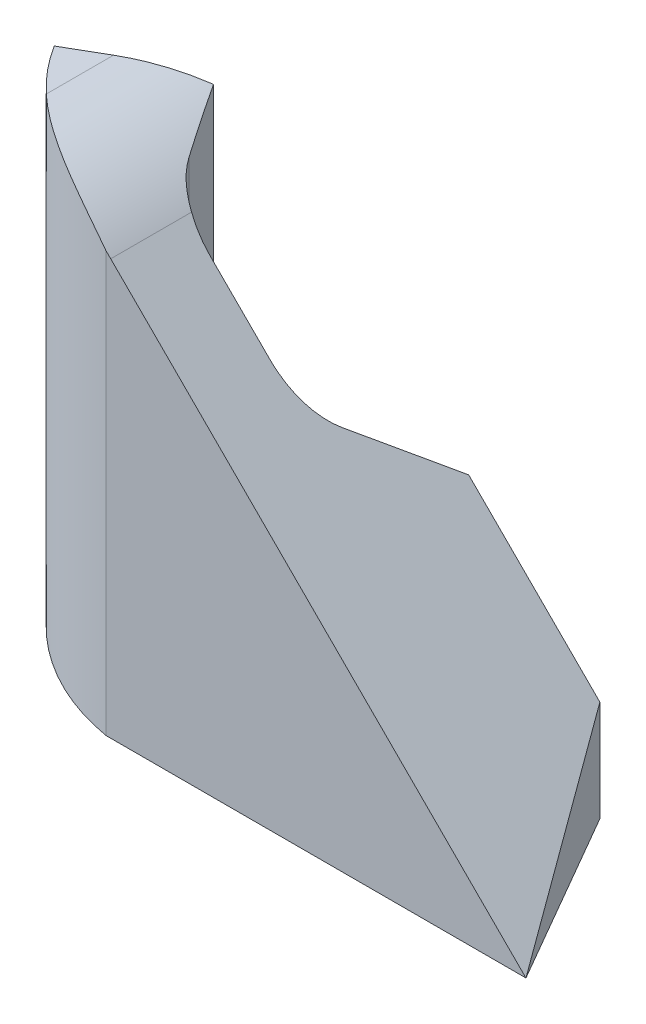
ISO-10303-21;
HEADER;
FILE_DESCRIPTION(('STEP AP214'),'2;1');
FILE_NAME('part.step','',(''),(''),'','','');
FILE_SCHEMA(('AUTOMOTIVE_DESIGN { 1 0 10303 214 1 1 1 1 }'));
ENDSEC;
DATA;
#1=APPLICATION_CONTEXT('core data for automotive mechanical design processes');
#2=APPLICATION_PROTOCOL_DEFINITION('international standard','automotive_design',2000,#1);
#3=PRODUCT_CONTEXT('',#1,'mechanical');
#4=PRODUCT('Part','Part','',(#3));
#5=PRODUCT_RELATED_PRODUCT_CATEGORY('part','',(#4));
#6=PRODUCT_DEFINITION_FORMATION('','',#4);
#7=PRODUCT_DEFINITION_CONTEXT('part definition',#1,'design');
#8=PRODUCT_DEFINITION('design','',#6,#7);
#9=PRODUCT_DEFINITION_SHAPE('','',#8);
#10=(LENGTH_UNIT() NAMED_UNIT(*) SI_UNIT(.MILLI.,.METRE.));
#11=(NAMED_UNIT(*) PLANE_ANGLE_UNIT() SI_UNIT($,.RADIAN.));
#12=(NAMED_UNIT(*) SI_UNIT($,.STERADIAN.) SOLID_ANGLE_UNIT());
#13=UNCERTAINTY_MEASURE_WITH_UNIT(LENGTH_MEASURE(1.E-05),#10,'distance_accuracy_value','');
#14=(GEOMETRIC_REPRESENTATION_CONTEXT(3) GLOBAL_UNCERTAINTY_ASSIGNED_CONTEXT((#13)) GLOBAL_UNIT_ASSIGNED_CONTEXT((#10,
#11,#12)) REPRESENTATION_CONTEXT('',''));
#15=CARTESIAN_POINT('',(0.,0.,0.));
#16=DIRECTION('',(0.,0.,1.));
#17=DIRECTION('',(1.,0.,0.));
#18=AXIS2_PLACEMENT_3D('',#15,#16,#17);
#19=CARTESIAN_POINT('',(84.7532992108684,80.,-39.1871510775911));
#20=DIRECTION('',(0.,-1.,0.));
#21=DIRECTION('',(0.,0.,-1.));
#22=AXIS2_PLACEMENT_3D('',#19,#20,#21);
#23=CYLINDRICAL_SURFACE('',#22,39.7648067995995);
#24=DIRECTION('',(0.,-1.,0.));
#25=VECTOR('',#24,1.);
#26=CARTESIAN_POINT('',(77.9999999999994,80.,0.));
#27=LINE('',#26,#25);
#28=CARTESIAN_POINT('',(77.9999999999994,71.9718433985966,0.));
#29=VERTEX_POINT('',#28);
#30=CARTESIAN_POINT('',(77.9999999999994,0.,0.));
#31=VERTEX_POINT('',#30);
#32=EDGE_CURVE('E146',#29,#31,#27,.T.);
#33=ORIENTED_EDGE('',*,*,#32,.F.);
#34=CARTESIAN_POINT('',(77.9999999999994,71.9718433985966,0.));
#35=CARTESIAN_POINT('',(77.7335986619102,72.2195183677995,-0.0459073022775095));
#36=CARTESIAN_POINT('',(77.4630042014682,72.4620357358725,-0.0953401702948594));
#37=CARTESIAN_POINT('',(76.9140353574111,72.9364070782736,-0.201718899229497));
#38=CARTESIAN_POINT('',(76.6356606105425,73.1682605533742,-0.258665111400422));
#39=CARTESIAN_POINT('',(76.0717107837595,73.6209742395291,-0.380539368932625));
#40=CARTESIAN_POINT('',(75.786134391271,73.8418324244412,-0.445468877812701));
#41=CARTESIAN_POINT('',(75.2085472406642,74.2721684005322,-0.583708182089227));
#42=CARTESIAN_POINT('',(74.9165365938317,74.4816463883244,-0.657017832635819));
#43=CARTESIAN_POINT('',(74.0352357765432,75.0902705688337,-0.889235820381399));
#44=CARTESIAN_POINT('',(73.4373461667372,75.472273521661,-1.06114041682028));
#45=CARTESIAN_POINT('',(72.2251335851486,76.1883194185665,-1.44210372319843));
#46=CARTESIAN_POINT('',(71.610812865398,76.5223688955463,-1.65115736346832));
#47=CARTESIAN_POINT('',(70.370520504923,77.1425968785391,-2.10867417547363));
#48=CARTESIAN_POINT('',(69.7445228537363,77.4286494184168,-2.35723781423036));
#49=CARTESIAN_POINT('',(68.4891576924157,77.951976990873,-2.89412644327581));
#50=CARTESIAN_POINT('',(67.8597899040653,78.1892479306199,-3.18245476647861));
#51=CARTESIAN_POINT('',(66.603441804,78.616477038177,-3.79911743907938));
#52=CARTESIAN_POINT('',(65.9764661427202,78.8063676450469,-4.12750793265412));
#53=CARTESIAN_POINT('',(64.7320271951322,79.1405539467785,-4.82297639926268));
#54=CARTESIAN_POINT('',(64.1145628244505,79.2848548764285,-5.19004992409725));
#55=CARTESIAN_POINT('',(62.9804223044365,79.5135950197848,-5.9070293495262));
#56=CARTESIAN_POINT('',(62.4617831542531,79.6035986122286,-6.25209072772108));
#57=CARTESIAN_POINT('',(61.4385189087551,79.7544923587507,-6.96835373908412));
#58=CARTESIAN_POINT('',(60.933894219566,79.8153816699529,-7.33955612869351));
#59=CARTESIAN_POINT('',(59.9422380733915,79.9104852415791,-8.10591952332908));
#60=CARTESIAN_POINT('',(59.455172672871,79.9447539267262,-8.50102985634323));
#61=CARTESIAN_POINT('',(58.7386850550771,79.9783211654342,-9.11094559393041));
#62=CARTESIAN_POINT('',(58.5022301611165,79.9865376821463,-9.31710475288899));
#63=CARTESIAN_POINT('',(58.0342049693713,79.9973767247314,-9.73501571502693));
#64=CARTESIAN_POINT('',(57.8026344201574,79.9999995392483,-9.94676722906085));
#65=CARTESIAN_POINT('',(57.5735931288057,80.,-10.161241322647));
#66=B_SPLINE_CURVE_WITH_KNOTS('',3,(#34,#35,#36,#37,#38,#39,#40,#41,#42,#43,#44,#45,#46,#47,#48,
#49,#50,#51,#52,#53,#54,#55,#56,#57,#58,#59,#60,#61,#62,#63,#64,#65),.UNSPECIFIED.,.F.,.F.,(4,2,
2,2,2,2,2,2,2,2,2,2,2,2,2,4),(0.,1.09982775196754,2.1997069398163,3.29978806186719,
4.39985017200724,6.58704212809706,8.77393583057388,10.9664821013058,13.1592122541579,
15.3550514398785,17.5506383988797,19.4374786655233,21.3243735540279,23.207400539619,
24.1487288660829,25.0900086173079),.UNSPECIFIED.);
#67=CARTESIAN_POINT('',(57.5735931288057,80.,-10.161241322647));
#68=VERTEX_POINT('',#67);
#69=EDGE_CURVE('E188',#29,#68,#66,.T.);
#70=ORIENTED_EDGE('',*,*,#69,.T.);
#71=CARTESIAN_POINT('',(84.7532992108684,80.,-39.1871510775911));
#72=DIRECTION('',(0.,1.,0.));
#73=DIRECTION('',(0.,0.,1.));
#74=AXIS2_PLACEMENT_3D('',#71,#72,#73);
#75=CIRCLE('',#74,39.7648067995995);
#76=CARTESIAN_POINT('',(51.120447451922,80.,-17.9722708665173));
#77=VERTEX_POINT('',#76);
#78=EDGE_CURVE('E169',#77,#68,#75,.T.);
#79=ORIENTED_EDGE('',*,*,#78,.F.);
#80=DIRECTION('',(0.,-1.,0.));
#81=VECTOR('',#80,1.);
#82=CARTESIAN_POINT('',(51.120447451922,80.,-17.9722708665173));
#83=LINE('',#82,#81);
#84=CARTESIAN_POINT('',(51.120447451922,0.,-17.9722708665173));
#85=VERTEX_POINT('',#84);
#86=EDGE_CURVE('E170',#77,#85,#83,.T.);
#87=ORIENTED_EDGE('',*,*,#86,.T.);
#88=CARTESIAN_POINT('',(84.7532992108684,0.,-39.1871510775911));
#89=DIRECTION('',(0.,1.,0.));
#90=DIRECTION('',(0.,0.,1.));
#91=AXIS2_PLACEMENT_3D('',#88,#89,#90);
#92=CIRCLE('',#91,39.7648067995995);
#93=EDGE_CURVE('E139',#85,#31,#92,.T.);
#94=ORIENTED_EDGE('',*,*,#93,.T.);
#95=EDGE_LOOP('',(#33,#70,#79,#87,#94));
#96=FACE_BOUND('',#95,.T.);
#97=ADVANCED_FACE('F33',(#96),#23,.T.);
#98=CARTESIAN_POINT('',(77.9999999999994,80.,0.));
#99=DIRECTION('',(0.,0.,-1.));
#100=DIRECTION('',(-1.,0.,0.));
#101=AXIS2_PLACEMENT_3D('',#98,#99,#100);
#102=PLANE('',#101);
#103=DIRECTION('',(0.707106781186551,-0.707106781186543,0.));
#104=VECTOR('',#103,1.);
#105=CARTESIAN_POINT('',(69.9999999999985,80.,0.));
#106=LINE('',#105,#104);
#107=CARTESIAN_POINT('',(78.786796564402,71.2132034355966,0.));
#108=VERTEX_POINT('',#107);
#109=CARTESIAN_POINT('',(149.999999999999,0.,0.));
#110=VERTEX_POINT('',#109);
#111=EDGE_CURVE('E118',#108,#110,#106,.T.);
#112=ORIENTED_EDGE('',*,*,#111,.F.);
#113=CARTESIAN_POINT('',(57.5735931288057,50.,0.));
#114=DIRECTION('',(0.,0.,-1.));
#115=DIRECTION('',(-1.,0.,0.));
#116=AXIS2_PLACEMENT_3D('',#113,#114,#115);
#117=CIRCLE('',#116,30.);
#118=EDGE_CURVE('E186',#108,#29,#117,.F.);
#119=ORIENTED_EDGE('',*,*,#118,.T.);
#120=ORIENTED_EDGE('',*,*,#32,.T.);
#121=DIRECTION('',(1.,0.,0.));
#122=VECTOR('',#121,1.);
#123=CARTESIAN_POINT('',(77.9999999999994,0.,0.));
#124=LINE('',#123,#122);
#125=EDGE_CURVE('E143',#31,#110,#124,.T.);
#126=ORIENTED_EDGE('',*,*,#125,.T.);
#127=EDGE_LOOP('',(#112,#119,#120,#126));
#128=FACE_BOUND('',#127,.T.);
#129=ADVANCED_FACE('F144',(#128),#102,.F.);
#130=CARTESIAN_POINT('',(132.679491924311,80.,-30.));
#131=DIRECTION('',(-0.866025403784444,0.,0.499999999999992));
#132=DIRECTION('',(0.499999999999992,0.,0.866025403784444));
#133=AXIS2_PLACEMENT_3D('',#130,#131,#132);
#134=PLANE('',#133);
#135=DIRECTION('',(0.,-1.,0.));
#136=VECTOR('',#135,1.);
#137=CARTESIAN_POINT('',(132.679491924311,80.,-30.));
#138=LINE('',#137,#136);
#139=CARTESIAN_POINT('',(132.679491924311,17.3205080756882,-30.));
#140=VERTEX_POINT('',#139);
#141=CARTESIAN_POINT('',(132.679491924311,0.,-30.));
#142=VERTEX_POINT('',#141);
#143=EDGE_CURVE('E138',#140,#142,#138,.T.);
#144=ORIENTED_EDGE('',*,*,#143,.F.);
#145=DIRECTION('',(0.447213595499953,-0.447213595499948,0.774596669241492));
#146=VECTOR('',#145,1.);
#147=CARTESIAN_POINT('',(120.143593539449,29.85640646055,-51.712812921102));
#148=LINE('',#147,#146);
#149=EDGE_CURVE('E123',#140,#110,#148,.T.);
#150=ORIENTED_EDGE('',*,*,#149,.T.);
#151=DIRECTION('',(-0.499999999999992,0.,-0.866025403784444));
#152=VECTOR('',#151,1.);
#153=CARTESIAN_POINT('',(132.679491924311,0.,-30.));
#154=LINE('',#153,#152);
#155=EDGE_CURVE('E136',#110,#142,#154,.T.);
#156=ORIENTED_EDGE('',*,*,#155,.T.);
#157=EDGE_LOOP('',(#144,#150,#156));
#158=FACE_BOUND('',#157,.T.);
#159=ADVANCED_FACE('F134',(#158),#134,.F.);
#160=CARTESIAN_POINT('',(110.179491924311,80.,-30.));
#161=DIRECTION('',(0.,0.,1.));
#162=DIRECTION('',(1.,0.,0.));
#163=AXIS2_PLACEMENT_3D('',#160,#161,#162);
#164=PLANE('',#163);
#165=DIRECTION('',(0.,-1.,0.));
#166=VECTOR('',#165,1.);
#167=CARTESIAN_POINT('',(110.179491924311,80.,-30.));
#168=LINE('',#167,#166);
#169=CARTESIAN_POINT('',(110.179491924311,39.8205080756879,-30.));
#170=VERTEX_POINT('',#169);
#171=CARTESIAN_POINT('',(110.179491924311,0.,-30.));
#172=VERTEX_POINT('',#171);
#173=EDGE_CURVE('E181',#170,#172,#168,.T.);
#174=ORIENTED_EDGE('',*,*,#173,.F.);
#175=DIRECTION('',(0.707106781186552,-0.707106781186544,0.));
#176=VECTOR('',#175,1.);
#177=CARTESIAN_POINT('',(90.089745962155,59.9102540378437,-30.));
#178=LINE('',#177,#176);
#179=EDGE_CURVE('E140',#170,#140,#178,.T.);
#180=ORIENTED_EDGE('',*,*,#179,.T.);
#181=ORIENTED_EDGE('',*,*,#143,.T.);
#182=DIRECTION('',(-1.,0.,0.));
#183=VECTOR('',#182,1.);
#184=CARTESIAN_POINT('',(110.179491924311,0.,-30.));
#185=LINE('',#184,#183);
#186=EDGE_CURVE('E152',#142,#172,#185,.T.);
#187=ORIENTED_EDGE('',*,*,#186,.T.);
#188=EDGE_LOOP('',(#174,#180,#181,#187));
#189=FACE_BOUND('',#188,.T.);
#190=ADVANCED_FACE('F207',(#189),#164,.F.);
#191=CARTESIAN_POINT('',(110.179491924311,80.,-30.));
#192=DIRECTION('',(0.819152044288989,0.,0.57357643635105));
#193=DIRECTION('',(0.57357643635105,0.,-0.819152044288989));
#194=AXIS2_PLACEMENT_3D('',#191,#192,#193);
#195=PLANE('',#194);
#196=DIRECTION('',(-0.57357643635105,0.,0.819152044288989));
#197=VECTOR('',#196,1.);
#198=CARTESIAN_POINT('',(110.179491924311,0.,-30.));
#199=LINE('',#198,#197);
#200=CARTESIAN_POINT('',(101.261813712118,0.,-17.2642356364895));
#201=VERTEX_POINT('',#200);
#202=EDGE_CURVE('E154',#172,#201,#199,.T.);
#203=ORIENTED_EDGE('',*,*,#202,.T.);
#204=DIRECTION('',(0.,-1.,0.));
#205=VECTOR('',#204,1.);
#206=CARTESIAN_POINT('',(101.261813712118,51.724036225253,-17.2642356364895));
#207=LINE('',#206,#205);
#208=CARTESIAN_POINT('',(101.261813712118,48.7381862878806,-17.2642356364895));
#209=VERTEX_POINT('',#208);
#210=EDGE_CURVE('E54',#201,#209,#207,.F.);
#211=ORIENTED_EDGE('',*,*,#210,.T.);
#212=DIRECTION('',(0.497542812164527,-0.497542812164521,-0.710564775461628));
#213=VECTOR('',#212,1.);
#214=CARTESIAN_POINT('',(100.233104907411,49.7668950925875,-15.7950872075292));
#215=LINE('',#214,#213);
#216=EDGE_CURVE('E250',#209,#170,#215,.T.);
#217=ORIENTED_EDGE('',*,*,#216,.T.);
#218=ORIENTED_EDGE('',*,*,#173,.T.);
#219=EDGE_LOOP('',(#203,#211,#217,#218));
#220=FACE_BOUND('',#219,.T.);
#221=ADVANCED_FACE('F210',(#220),#195,.F.);
#222=CARTESIAN_POINT('',(98.2759637747458,80.,-13.));
#223=DIRECTION('',(0.,0.,1.));
#224=DIRECTION('',(1.,0.,0.));
#225=AXIS2_PLACEMENT_3D('',#222,#223,#224);
#226=PLANE('',#225);
#227=DIRECTION('',(0.707106781186552,-0.707106781186544,0.));
#228=VECTOR('',#227,1.);
#229=CARTESIAN_POINT('',(84.1379818873723,65.8620181126263,-13.));
#230=LINE('',#229,#228);
#231=CARTESIAN_POINT('',(82.8597570149226,67.140242985076,-13.));
#232=VERTEX_POINT('',#231);
#233=CARTESIAN_POINT('',(93.0702932692284,56.9297067307704,-13.));
#234=VERTEX_POINT('',#233);
#235=EDGE_CURVE('E241',#232,#234,#230,.T.);
#236=ORIENTED_EDGE('',*,*,#235,.T.);
#237=DIRECTION('',(0.,-1.,0.));
#238=VECTOR('',#237,1.);
#239=CARTESIAN_POINT('',(93.0702932692284,0.,-13.));
#240=LINE('',#239,#238);
#241=CARTESIAN_POINT('',(93.0702932692284,0.,-13.));
#242=VERTEX_POINT('',#241);
#243=EDGE_CURVE('E233',#234,#242,#240,.T.);
#244=ORIENTED_EDGE('',*,*,#243,.T.);
#245=DIRECTION('',(-1.,0.,0.));
#246=VECTOR('',#245,1.);
#247=CARTESIAN_POINT('',(98.2759637747458,0.,-13.));
#248=LINE('',#247,#246);
#249=CARTESIAN_POINT('',(82.8597570149226,0.,-13.));
#250=VERTEX_POINT('',#249);
#251=EDGE_CURVE('E159',#242,#250,#248,.T.);
#252=ORIENTED_EDGE('',*,*,#251,.T.);
#253=DIRECTION('',(0.,-1.,0.));
#254=VECTOR('',#253,1.);
#255=CARTESIAN_POINT('',(82.8597570149226,80.,-13.));
#256=LINE('',#255,#254);
#257=EDGE_CURVE('E178',#232,#250,#256,.T.);
#258=ORIENTED_EDGE('',*,*,#257,.F.);
#259=EDGE_LOOP('',(#236,#244,#252,#258));
#260=FACE_BOUND('',#259,.T.);
#261=ADVANCED_FACE('F214',(#260),#226,.F.);
#262=CARTESIAN_POINT('',(82.8597570149226,80.,-23.));
#263=DIRECTION('',(0.,-1.,0.));
#264=DIRECTION('',(0.,0.,-1.));
#265=AXIS2_PLACEMENT_3D('',#262,#263,#264);
#266=CYLINDRICAL_SURFACE('',#265,10.);
#267=DIRECTION('',(0.,-1.,0.));
#268=VECTOR('',#267,1.);
#269=CARTESIAN_POINT('',(74.1998993620392,80.,-17.999313503948));
#270=LINE('',#269,#268);
#271=CARTESIAN_POINT('',(74.1998993620392,74.9713023496721,-17.999313503948));
#272=VERTEX_POINT('',#271);
#273=CARTESIAN_POINT('',(74.1998993620392,0.,-17.999313503948));
#274=VERTEX_POINT('',#273);
#275=EDGE_CURVE('E176',#272,#274,#270,.T.);
#276=ORIENTED_EDGE('',*,*,#275,.F.);
#277=CARTESIAN_POINT('',(74.1998993620392,74.9713023496721,-17.999313503948));
#278=CARTESIAN_POINT('',(74.2682942001272,74.9257635992787,-17.8808688704528));
#279=CARTESIAN_POINT('',(74.338807199539,74.8784095191008,-17.7643745868177));
#280=CARTESIAN_POINT('',(74.4837784999972,74.7800990411433,-17.5354472370504));
#281=CARTESIAN_POINT('',(74.5582364374065,74.7291429752439,-17.4230137981983));
#282=CARTESIAN_POINT('',(74.7869456229526,74.5710153683436,-17.0922520528885));
#283=CARTESIAN_POINT('',(74.9466814686044,74.4584857747188,-16.8802054031467));
#284=CARTESIAN_POINT('',(75.2771193827899,74.2203711364371,-16.4753145739116));
#285=CARTESIAN_POINT('',(75.4477493470668,74.0948690976265,-16.2823620945881));
#286=CARTESIAN_POINT('',(75.7983544904712,73.8307832152295,-15.9147252627994));
#287=CARTESIAN_POINT('',(75.9783310504936,73.6921974361226,-15.7400436212809));
#288=CARTESIAN_POINT('',(76.3445186890343,73.4031319002577,-15.4097245127042));
#289=CARTESIAN_POINT('',(76.5307067959554,73.2526936576311,-15.2540250491079));
#290=CARTESIAN_POINT('',(76.9076159790382,72.9402588806868,-14.9607812123712));
#291=CARTESIAN_POINT('',(77.0983373601995,72.778261567196,-14.8232380648953));
#292=CARTESIAN_POINT('',(77.4822177139113,72.4435188464881,-14.5658139373565));
#293=CARTESIAN_POINT('',(77.6753768079656,72.2707729018231,-14.4459338414844));
#294=CARTESIAN_POINT('',(78.0622341112696,71.9153949090664,-14.2231224363624));
#295=CARTESIAN_POINT('',(78.2559321121838,71.732766282567,-14.1201853103587));
#296=CARTESIAN_POINT('',(78.5055184123884,71.4909444726143,-13.9975246748235));
#297=CARTESIAN_POINT('',(78.5619028631364,71.4358836310205,-13.9704751054764));
#298=CARTESIAN_POINT('',(78.674481402356,71.32507298927,-13.9177466983789));
#299=CARTESIAN_POINT('',(78.7306756408031,71.2693241384142,-13.8920661862161));
#300=CARTESIAN_POINT('',(78.786796564402,71.2132034355966,-13.8670380944354));
#301=B_SPLINE_CURVE_WITH_KNOTS('',3,(#277,#278,#279,#280,#281,#282,#283,#284,#285,#286,#287,
#288,#289,#290,#291,#292,#293,#294,#295,#296,#297,#298,#299,#300),.UNSPECIFIED.,.F.,.F.,(4,2,2,
2,2,2,2,2,2,2,2,4),(0.,0.43238034761962,0.864720908330781,1.72846649726907,2.58699232678957,
3.44564536043946,4.30141427136555,5.15724092251523,6.01311040075772,6.86868543162434,
7.11864325620037,7.36828800760188),.UNSPECIFIED.);
#302=CARTESIAN_POINT('',(78.786796564402,71.2132034355966,-13.8670380944354));
#303=VERTEX_POINT('',#302);
#304=EDGE_CURVE('E226',#272,#303,#301,.T.);
#305=ORIENTED_EDGE('',*,*,#304,.T.);
#306=CARTESIAN_POINT('',(82.8597570149226,67.140242985076,-23.));
#307=DIRECTION('',(-0.707106781186543,-0.707106781186551,0.));
#308=DIRECTION('',(0.707106781186552,-0.707106781186544,0.));
#309=AXIS2_PLACEMENT_3D('',#306,#307,#308);
#310=ELLIPSE('',#309,14.1421356237309,10.);
#311=EDGE_CURVE('E129',#303,#232,#310,.F.);
#312=ORIENTED_EDGE('',*,*,#311,.T.);
#313=ORIENTED_EDGE('',*,*,#257,.T.);
#314=CARTESIAN_POINT('',(82.8597570149226,0.,-23.));
#315=DIRECTION('',(0.,-1.,0.));
#316=DIRECTION('',(0.,0.,-1.));
#317=AXIS2_PLACEMENT_3D('',#314,#315,#316);
#318=CIRCLE('',#317,10.);
#319=EDGE_CURVE('E161',#250,#274,#318,.T.);
#320=ORIENTED_EDGE('',*,*,#319,.T.);
#321=EDGE_LOOP('',(#276,#305,#312,#313,#320));
#322=FACE_BOUND('',#321,.T.);
#323=ADVANCED_FACE('F217',(#322),#266,.F.);
#324=CARTESIAN_POINT('',(74.1998993620392,80.,-17.999313503948));
#325=DIRECTION('',(-0.865985765288341,0.,0.500068649605198));
#326=DIRECTION('',(0.500068649605198,0.,0.865985765288341));
#327=AXIS2_PLACEMENT_3D('',#324,#325,#326);
#328=PLANE('',#327);
#329=DIRECTION('',(0.,-1.,0.));
#330=VECTOR('',#329,1.);
#331=CARTESIAN_POINT('',(68.4401627576889,80.,-27.9736438586213));
#332=LINE('',#331,#330);
#333=CARTESIAN_POINT('',(68.4401627576889,77.9627907137438,-27.9736438586213));
#334=VERTEX_POINT('',#333);
#335=CARTESIAN_POINT('',(68.4401627576889,0.,-27.9736438586213));
#336=VERTEX_POINT('',#335);
#337=EDGE_CURVE('E173',#334,#336,#332,.T.);
#338=ORIENTED_EDGE('',*,*,#337,.F.);
#339=CARTESIAN_POINT('',(57.5735931288057,50.,-46.791649393575));
#340=DIRECTION('',(-0.865985765288341,0.,0.500068649605198));
#341=DIRECTION('',(-0.500068649605198,0.,-0.865985765288341));
#342=AXIS2_PLACEMENT_3D('',#339,#340,#341);
#343=ELLIPSE('',#342,59.9917631782853,30.);
#344=EDGE_CURVE('E234',#334,#272,#343,.F.);
#345=ORIENTED_EDGE('',*,*,#344,.T.);
#346=ORIENTED_EDGE('',*,*,#275,.T.);
#347=DIRECTION('',(-0.500068649605198,0.,-0.865985765288341));
#348=VECTOR('',#347,1.);
#349=CARTESIAN_POINT('',(74.1998993620392,0.,-17.999313503948));
#350=LINE('',#349,#348);
#351=EDGE_CURVE('E164',#274,#336,#350,.T.);
#352=ORIENTED_EDGE('',*,*,#351,.T.);
#353=EDGE_LOOP('',(#338,#345,#346,#352));
#354=FACE_BOUND('',#353,.T.);
#355=ADVANCED_FACE('F222',(#354),#328,.F.);
#356=CARTESIAN_POINT('',(68.4401627576889,80.,-27.9736438586213));
#357=DIRECTION('',(0.500068649605197,0.,0.865985765288341));
#358=DIRECTION('',(0.865985765288341,0.,-0.500068649605197));
#359=AXIS2_PLACEMENT_3D('',#356,#357,#358);
#360=PLANE('',#359);
#361=DIRECTION('',(-0.865985765288341,0.,0.500068649605197));
#362=VECTOR('',#361,1.);
#363=CARTESIAN_POINT('',(68.4401627576889,80.,-27.9736438586213));
#364=LINE('',#363,#362);
#365=CARTESIAN_POINT('',(57.5735931288057,80.,-21.6986783592206));
#366=VERTEX_POINT('',#365);
#367=EDGE_CURVE('E174',#366,#77,#364,.T.);
#368=ORIENTED_EDGE('',*,*,#367,.F.);
#369=CARTESIAN_POINT('',(57.5735931288057,50.,-21.6986783592206));
#370=DIRECTION('',(0.500068649605197,0.,0.865985765288341));
#371=DIRECTION('',(0.865985765288341,0.,-0.500068649605197));
#372=AXIS2_PLACEMENT_3D('',#369,#370,#371);
#373=ELLIPSE('',#372,34.6426017637959,30.);
#374=EDGE_CURVE('E265',#366,#334,#373,.F.);
#375=ORIENTED_EDGE('',*,*,#374,.T.);
#376=ORIENTED_EDGE('',*,*,#337,.T.);
#377=DIRECTION('',(-0.865985765288341,0.,0.500068649605197));
#378=VECTOR('',#377,1.);
#379=CARTESIAN_POINT('',(68.4401627576889,0.,-27.9736438586213));
#380=LINE('',#379,#378);
#381=EDGE_CURVE('E167',#336,#85,#380,.T.);
#382=ORIENTED_EDGE('',*,*,#381,.T.);
#383=ORIENTED_EDGE('',*,*,#86,.F.);
#384=EDGE_LOOP('',(#368,#375,#376,#382,#383));
#385=FACE_BOUND('',#384,.T.);
#386=ADVANCED_FACE('F262',(#385),#360,.F.);
#387=CARTESIAN_POINT('',(84.7532992108684,80.,-39.1871510775911));
#388=DIRECTION('',(0.,1.,0.));
#389=DIRECTION('',(0.,0.,1.));
#390=AXIS2_PLACEMENT_3D('',#387,#388,#389);
#391=PLANE('',#390);
#392=ORIENTED_EDGE('',*,*,#78,.T.);
#393=DIRECTION('',(0.,0.,1.));
#394=VECTOR('',#393,1.);
#395=CARTESIAN_POINT('',(57.5735931288057,80.,-25.2724210383682));
#396=LINE('',#395,#394);
#397=EDGE_CURVE('E195',#68,#366,#396,.F.);
#398=ORIENTED_EDGE('',*,*,#397,.T.);
#399=ORIENTED_EDGE('',*,*,#367,.T.);
#400=EDGE_LOOP('',(#392,#398,#399));
#401=FACE_BOUND('',#400,.T.);
#402=ADVANCED_FACE('F271',(#401),#391,.T.);
#403=CARTESIAN_POINT('',(84.7532992108684,0.,-39.1871510775911));
#404=DIRECTION('',(0.,1.,0.));
#405=DIRECTION('',(0.,0.,1.));
#406=AXIS2_PLACEMENT_3D('',#403,#404,#405);
#407=PLANE('',#406);
#408=ORIENTED_EDGE('',*,*,#93,.F.);
#409=ORIENTED_EDGE('',*,*,#381,.F.);
#410=ORIENTED_EDGE('',*,*,#351,.F.);
#411=ORIENTED_EDGE('',*,*,#319,.F.);
#412=ORIENTED_EDGE('',*,*,#251,.F.);
#413=CARTESIAN_POINT('',(93.0702932692284,0.,-23.));
#414=DIRECTION('',(0.,1.,0.));
#415=DIRECTION('',(0.,0.,1.));
#416=AXIS2_PLACEMENT_3D('',#413,#414,#415);
#417=CIRCLE('',#416,10.);
#418=EDGE_CURVE('E41',#242,#201,#417,.T.);
#419=ORIENTED_EDGE('',*,*,#418,.T.);
#420=ORIENTED_EDGE('',*,*,#202,.F.);
#421=ORIENTED_EDGE('',*,*,#186,.F.);
#422=ORIENTED_EDGE('',*,*,#155,.F.);
#423=ORIENTED_EDGE('',*,*,#125,.F.);
#424=EDGE_LOOP('',(#408,#409,#410,#411,#412,#419,#420,#421,#422,#423));
#425=FACE_BOUND('',#424,.T.);
#426=ADVANCED_FACE('F150',(#425),#407,.F.);
#427=CARTESIAN_POINT('',(69.9999999999985,80.,-60.));
#428=DIRECTION('',(-0.707106781186543,-0.707106781186551,0.));
#429=DIRECTION('',(0.707106781186552,-0.707106781186544,0.));
#430=AXIS2_PLACEMENT_3D('',#427,#428,#429);
#431=PLANE('',#430);
#432=ORIENTED_EDGE('',*,*,#311,.F.);
#433=DIRECTION('',(0.,0.,1.));
#434=VECTOR('',#433,1.);
#435=CARTESIAN_POINT('',(78.786796564402,71.2132034355966,-2.26046665827154));
#436=LINE('',#435,#434);
#437=EDGE_CURVE('E126',#303,#108,#436,.T.);
#438=ORIENTED_EDGE('',*,*,#437,.T.);
#439=ORIENTED_EDGE('',*,*,#111,.T.);
#440=ORIENTED_EDGE('',*,*,#149,.F.);
#441=ORIENTED_EDGE('',*,*,#179,.F.);
#442=ORIENTED_EDGE('',*,*,#216,.F.);
#443=CARTESIAN_POINT('',(93.0702932692284,56.9297067307703,-23.));
#444=DIRECTION('',(-0.707106781186543,-0.707106781186551,0.));
#445=DIRECTION('',(-0.707106781186552,0.707106781186544,0.));
#446=AXIS2_PLACEMENT_3D('',#443,#444,#445);
#447=ELLIPSE('',#446,14.1421356237309,10.);
#448=EDGE_CURVE('E11',#209,#234,#447,.T.);
#449=ORIENTED_EDGE('',*,*,#448,.T.);
#450=ORIENTED_EDGE('',*,*,#235,.F.);
#451=EDGE_LOOP('',(#432,#438,#439,#440,#441,#442,#449,#450));
#452=FACE_BOUND('',#451,.T.);
#453=ADVANCED_FACE('F121',(#452),#431,.F.);
#454=CARTESIAN_POINT('',(57.5735931288057,50.,-60.));
#455=DIRECTION('',(0.,0.,-1.));
#456=DIRECTION('',(-1.,0.,0.));
#457=AXIS2_PLACEMENT_3D('',#454,#455,#456);
#458=CYLINDRICAL_SURFACE('',#457,30.);
#459=ORIENTED_EDGE('',*,*,#374,.F.);
#460=ORIENTED_EDGE('',*,*,#397,.F.);
#461=ORIENTED_EDGE('',*,*,#69,.F.);
#462=ORIENTED_EDGE('',*,*,#118,.F.);
#463=ORIENTED_EDGE('',*,*,#437,.F.);
#464=ORIENTED_EDGE('',*,*,#304,.F.);
#465=ORIENTED_EDGE('',*,*,#344,.F.);
#466=EDGE_LOOP('',(#459,#460,#461,#462,#463,#464,#465));
#467=FACE_BOUND('',#466,.T.);
#468=ADVANCED_FACE('F197',(#467),#458,.T.);
#469=CARTESIAN_POINT('',(93.0702932692284,80.,-23.));
#470=DIRECTION('',(0.,1.,0.));
#471=DIRECTION('',(0.,0.,1.));
#472=AXIS2_PLACEMENT_3D('',#469,#470,#471);
#473=CYLINDRICAL_SURFACE('',#472,10.);
#474=ORIENTED_EDGE('',*,*,#448,.F.);
#475=ORIENTED_EDGE('',*,*,#210,.F.);
#476=ORIENTED_EDGE('',*,*,#418,.F.);
#477=ORIENTED_EDGE('',*,*,#243,.F.);
#478=EDGE_LOOP('',(#474,#475,#476,#477));
#479=FACE_BOUND('',#478,.T.);
#480=ADVANCED_FACE('F35',(#479),#473,.F.);
#481=CLOSED_SHELL('',(#97,#129,#159,#190,#221,#261,#323,#355,#386,#402,#426,#453,#468,#480));
#482=MANIFOLD_SOLID_BREP('B2',#481);
#483=ADVANCED_BREP_SHAPE_REPRESENTATION('',(#18,#482),#14);
#484=SHAPE_DEFINITION_REPRESENTATION(#9,#483);
ENDSEC;
END-ISO-10303-21;
